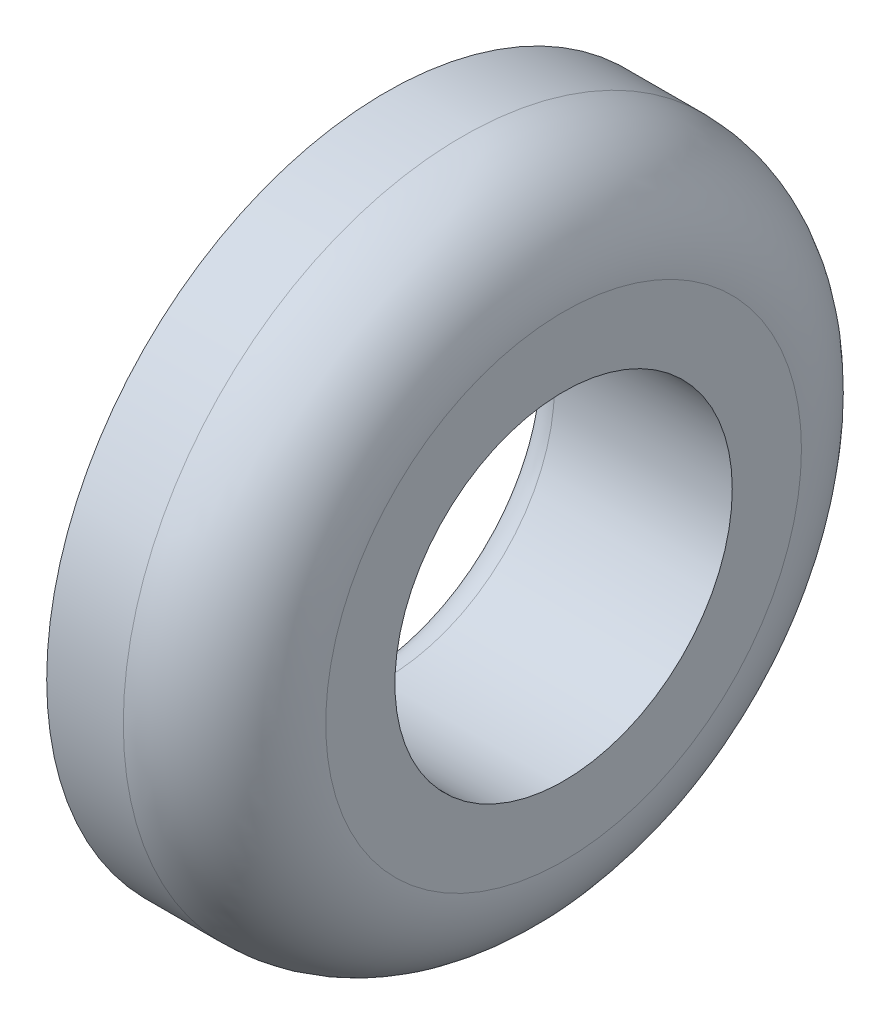
ISO-10303-21;
HEADER;
FILE_DESCRIPTION(('STEP AP214'),'2;1');
FILE_NAME('part.step','',(''),(''),'','','');
FILE_SCHEMA(('AUTOMOTIVE_DESIGN { 1 0 10303 214 1 1 1 1 }'));
ENDSEC;
DATA;
#1=APPLICATION_CONTEXT('core data for automotive mechanical design processes');
#2=APPLICATION_PROTOCOL_DEFINITION('international standard','automotive_design',2000,#1);
#3=PRODUCT_CONTEXT('',#1,'mechanical');
#4=PRODUCT('Part','Part','',(#3));
#5=PRODUCT_RELATED_PRODUCT_CATEGORY('part','',(#4));
#6=PRODUCT_DEFINITION_FORMATION('','',#4);
#7=PRODUCT_DEFINITION_CONTEXT('part definition',#1,'design');
#8=PRODUCT_DEFINITION('design','',#6,#7);
#9=PRODUCT_DEFINITION_SHAPE('','',#8);
#10=(LENGTH_UNIT() NAMED_UNIT(*) SI_UNIT(.MILLI.,.METRE.));
#11=(NAMED_UNIT(*) PLANE_ANGLE_UNIT() SI_UNIT($,.RADIAN.));
#12=(NAMED_UNIT(*) SI_UNIT($,.STERADIAN.) SOLID_ANGLE_UNIT());
#13=UNCERTAINTY_MEASURE_WITH_UNIT(LENGTH_MEASURE(1.E-05),#10,'distance_accuracy_value','');
#14=(GEOMETRIC_REPRESENTATION_CONTEXT(3) GLOBAL_UNCERTAINTY_ASSIGNED_CONTEXT((#13)) GLOBAL_UNIT_ASSIGNED_CONTEXT((#10,
#11,#12)) REPRESENTATION_CONTEXT('',''));
#15=CARTESIAN_POINT('',(0.,0.,0.));
#16=DIRECTION('',(0.,0.,1.));
#17=DIRECTION('',(1.,0.,0.));
#18=AXIS2_PLACEMENT_3D('',#15,#16,#17);
#19=CARTESIAN_POINT('',(0.,0.,0.));
#20=DIRECTION('',(1.,0.,0.));
#21=DIRECTION('',(0.,0.,-1.));
#22=AXIS2_PLACEMENT_3D('',#19,#20,#21);
#23=PLANE('',#22);
#24=CARTESIAN_POINT('',(0.,0.,0.));
#25=DIRECTION('',(1.,0.,0.));
#26=DIRECTION('',(0.,0.,-1.));
#27=AXIS2_PLACEMENT_3D('',#24,#25,#26);
#28=CIRCLE('',#27,10.5326528223969);
#29=CARTESIAN_POINT('',(0.,0.,-10.5326528223969));
#30=VERTEX_POINT('',#29);
#31=EDGE_CURVE('E53',#30,#30,#28,.F.);
#32=ORIENTED_EDGE('',*,*,#31,.T.);
#33=EDGE_LOOP('',(#32));
#34=FACE_BOUND('',#33,.T.);
#35=CARTESIAN_POINT('',(0.,0.,0.));
#36=DIRECTION('',(1.,0.,0.));
#37=DIRECTION('',(0.,0.,-1.));
#38=AXIS2_PLACEMENT_3D('',#35,#36,#37);
#39=CIRCLE('',#38,7.62);
#40=CARTESIAN_POINT('',(0.,0.,-7.62));
#41=VERTEX_POINT('',#40);
#42=EDGE_CURVE('E57',#41,#41,#39,.T.);
#43=ORIENTED_EDGE('',*,*,#42,.T.);
#44=EDGE_LOOP('',(#43));
#45=FACE_BOUND('',#44,.T.);
#46=ADVANCED_FACE('F46',(#34,#45),#23,.F.);
#47=CARTESIAN_POINT('',(7.9629,0.,0.));
#48=DIRECTION('',(-1.,0.,0.));
#49=DIRECTION('',(0.,0.,1.));
#50=AXIS2_PLACEMENT_3D('',#47,#48,#49);
#51=CYLINDRICAL_SURFACE('',#50,12.7635);
#52=CARTESIAN_POINT('',(4.1529,0.,0.));
#53=DIRECTION('',(1.,0.,0.));
#54=DIRECTION('',(0.,0.,-1.));
#55=AXIS2_PLACEMENT_3D('',#52,#53,#54);
#56=CIRCLE('',#55,12.7635);
#57=CARTESIAN_POINT('',(4.1529,0.,-12.7635));
#58=VERTEX_POINT('',#57);
#59=EDGE_CURVE('E61',#58,#58,#56,.F.);
#60=ORIENTED_EDGE('',*,*,#59,.T.);
#61=EDGE_LOOP('',(#60));
#62=FACE_BOUND('',#61,.T.);
#63=CARTESIAN_POINT('',(1.27,0.,0.));
#64=DIRECTION('',(-1.,0.,0.));
#65=DIRECTION('',(0.,0.,1.));
#66=AXIS2_PLACEMENT_3D('',#63,#64,#65);
#67=CIRCLE('',#66,12.7635);
#68=CARTESIAN_POINT('',(1.27,0.,12.7635));
#69=VERTEX_POINT('',#68);
#70=EDGE_CURVE('E72',#69,#69,#67,.T.);
#71=ORIENTED_EDGE('',*,*,#70,.F.);
#72=EDGE_LOOP('',(#71));
#73=FACE_BOUND('',#72,.T.);
#74=ADVANCED_FACE('F89',(#62,#73),#51,.T.);
#75=CARTESIAN_POINT('',(7.9629,0.,0.));
#76=DIRECTION('',(1.,0.,0.));
#77=DIRECTION('',(0.,0.,-1.));
#78=AXIS2_PLACEMENT_3D('',#75,#76,#77);
#79=PLANE('',#78);
#80=CARTESIAN_POINT('',(7.9629,0.,0.));
#81=DIRECTION('',(1.,0.,0.));
#82=DIRECTION('',(0.,0.,-1.));
#83=AXIS2_PLACEMENT_3D('',#80,#81,#82);
#84=CIRCLE('',#83,8.9535);
#85=CARTESIAN_POINT('',(7.9629,0.,-8.9535));
#86=VERTEX_POINT('',#85);
#87=EDGE_CURVE('E66',#86,#86,#84,.T.);
#88=ORIENTED_EDGE('',*,*,#87,.T.);
#89=EDGE_LOOP('',(#88));
#90=FACE_BOUND('',#89,.T.);
#91=CARTESIAN_POINT('',(7.9629,0.,0.));
#92=DIRECTION('',(1.,0.,0.));
#93=DIRECTION('',(0.,0.,-1.));
#94=AXIS2_PLACEMENT_3D('',#91,#92,#93);
#95=CIRCLE('',#94,6.35);
#96=CARTESIAN_POINT('',(7.9629,0.,-6.35));
#97=VERTEX_POINT('',#96);
#98=EDGE_CURVE('E69',#97,#97,#95,.T.);
#99=ORIENTED_EDGE('',*,*,#98,.F.);
#100=EDGE_LOOP('',(#99));
#101=FACE_BOUND('',#100,.T.);
#102=ADVANCED_FACE('F91',(#90,#101),#79,.T.);
#103=CARTESIAN_POINT('',(7.9629,0.,0.));
#104=DIRECTION('',(-1.,0.,0.));
#105=DIRECTION('',(0.,0.,1.));
#106=AXIS2_PLACEMENT_3D('',#103,#104,#105);
#107=CYLINDRICAL_SURFACE('',#106,6.35);
#108=CARTESIAN_POINT('',(1.27,0.,0.));
#109=DIRECTION('',(1.,0.,0.));
#110=DIRECTION('',(0.,0.,-1.));
#111=AXIS2_PLACEMENT_3D('',#108,#109,#110);
#112=CIRCLE('',#111,6.35);
#113=CARTESIAN_POINT('',(1.27,0.,-6.35));
#114=VERTEX_POINT('',#113);
#115=EDGE_CURVE('E12',#114,#114,#112,.F.);
#116=ORIENTED_EDGE('',*,*,#115,.T.);
#117=EDGE_LOOP('',(#116));
#118=FACE_BOUND('',#117,.T.);
#119=ORIENTED_EDGE('',*,*,#98,.T.);
#120=EDGE_LOOP('',(#119));
#121=FACE_BOUND('',#120,.T.);
#122=ADVANCED_FACE('F98',(#118,#121),#107,.F.);
#123=CARTESIAN_POINT('',(4.1529,0.,0.));
#124=DIRECTION('',(1.,0.,0.));
#125=DIRECTION('',(0.,0.,-1.));
#126=AXIS2_PLACEMENT_3D('',#123,#124,#125);
#127=TOROIDAL_SURFACE('',#126,8.9535,3.81);
#128=ORIENTED_EDGE('',*,*,#59,.F.);
#129=EDGE_LOOP('',(#128));
#130=FACE_BOUND('',#129,.T.);
#131=ORIENTED_EDGE('',*,*,#87,.F.);
#132=EDGE_LOOP('',(#131));
#133=FACE_BOUND('',#132,.T.);
#134=ADVANCED_FACE('F85',(#130,#133),#127,.T.);
#135=CARTESIAN_POINT('',(1.27,0.,0.));
#136=DIRECTION('',(-1.,0.,0.));
#137=DIRECTION('',(0.,0.,1.));
#138=AXIS2_PLACEMENT_3D('',#135,#136,#137);
#139=PLANE('',#138);
#140=CARTESIAN_POINT('',(1.27,0.,0.));
#141=DIRECTION('',(-1.,0.,0.));
#142=DIRECTION('',(0.,0.,1.));
#143=AXIS2_PLACEMENT_3D('',#140,#141,#142);
#144=CIRCLE('',#143,11.8026528223969);
#145=CARTESIAN_POINT('',(1.27,0.,11.8026528223969));
#146=VERTEX_POINT('',#145);
#147=EDGE_CURVE('E75',#146,#146,#144,.T.);
#148=ORIENTED_EDGE('',*,*,#147,.F.);
#149=EDGE_LOOP('',(#148));
#150=FACE_BOUND('',#149,.T.);
#151=ORIENTED_EDGE('',*,*,#70,.T.);
#152=EDGE_LOOP('',(#151));
#153=FACE_BOUND('',#152,.T.);
#154=ADVANCED_FACE('F82',(#150,#153),#139,.T.);
#155=CARTESIAN_POINT('',(1.27,0.,0.));
#156=DIRECTION('',(1.,0.,0.));
#157=DIRECTION('',(0.,0.,-1.));
#158=AXIS2_PLACEMENT_3D('',#155,#156,#157);
#159=TOROIDAL_SURFACE('',#158,10.5326528223969,1.27);
#160=ORIENTED_EDGE('',*,*,#147,.T.);
#161=EDGE_LOOP('',(#160));
#162=FACE_BOUND('',#161,.T.);
#163=ORIENTED_EDGE('',*,*,#31,.F.);
#164=EDGE_LOOP('',(#163));
#165=FACE_BOUND('',#164,.T.);
#166=ADVANCED_FACE('F79',(#162,#165),#159,.T.);
#167=CARTESIAN_POINT('',(1.27,0.,0.));
#168=DIRECTION('',(1.,0.,0.));
#169=DIRECTION('',(0.,0.,-1.));
#170=AXIS2_PLACEMENT_3D('',#167,#168,#169);
#171=TOROIDAL_SURFACE('',#170,7.62,1.27);
#172=ORIENTED_EDGE('',*,*,#115,.F.);
#173=EDGE_LOOP('',(#172));
#174=FACE_BOUND('',#173,.T.);
#175=ORIENTED_EDGE('',*,*,#42,.F.);
#176=EDGE_LOOP('',(#175));
#177=FACE_BOUND('',#176,.T.);
#178=ADVANCED_FACE('F48',(#174,#177),#171,.T.);
#179=CLOSED_SHELL('',(#46,#74,#102,#122,#134,#154,#166,#178));
#180=MANIFOLD_SOLID_BREP('B2',#179);
#181=ADVANCED_BREP_SHAPE_REPRESENTATION('',(#18,#180),#14);
#182=SHAPE_DEFINITION_REPRESENTATION(#9,#181);
ENDSEC;
END-ISO-10303-21;
